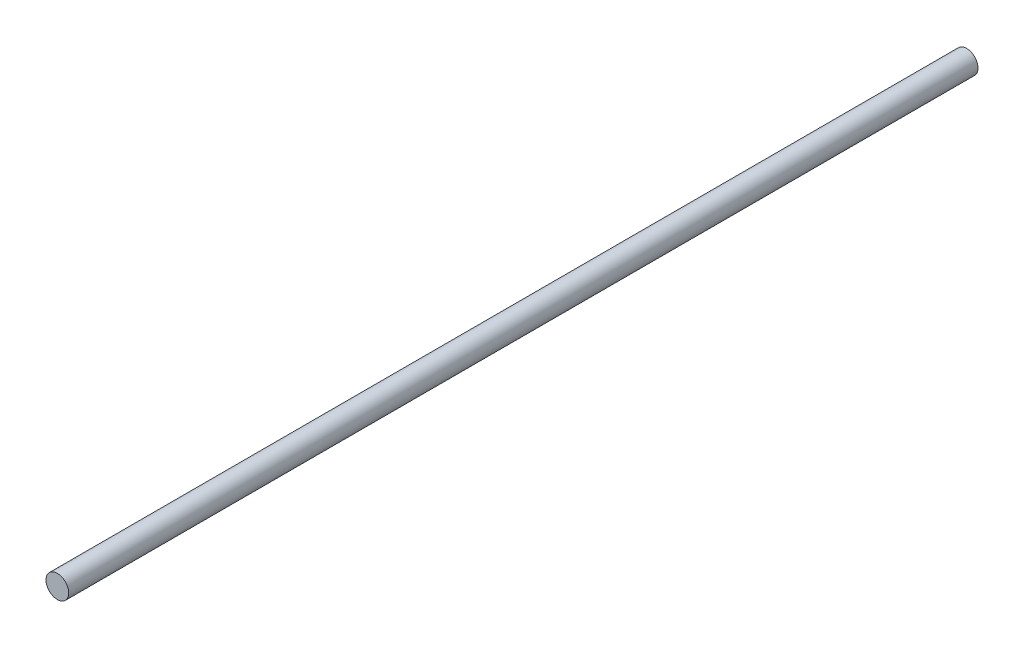
ISO-10303-21;
HEADER;
FILE_DESCRIPTION(('STEP AP214'),'2;1');
FILE_NAME('part.step','',(''),(''),'','','');
FILE_SCHEMA(('AUTOMOTIVE_DESIGN { 1 0 10303 214 1 1 1 1 }'));
ENDSEC;
DATA;
#1=APPLICATION_CONTEXT('core data for automotive mechanical design processes');
#2=APPLICATION_PROTOCOL_DEFINITION('international standard','automotive_design',2000,#1);
#3=PRODUCT_CONTEXT('',#1,'mechanical');
#4=PRODUCT('Part','Part','',(#3));
#5=PRODUCT_RELATED_PRODUCT_CATEGORY('part','',(#4));
#6=PRODUCT_DEFINITION_FORMATION('','',#4);
#7=PRODUCT_DEFINITION_CONTEXT('part definition',#1,'design');
#8=PRODUCT_DEFINITION('design','',#6,#7);
#9=PRODUCT_DEFINITION_SHAPE('','',#8);
#10=(LENGTH_UNIT() NAMED_UNIT(*) SI_UNIT(.MILLI.,.METRE.));
#11=(NAMED_UNIT(*) PLANE_ANGLE_UNIT() SI_UNIT($,.RADIAN.));
#12=(NAMED_UNIT(*) SI_UNIT($,.STERADIAN.) SOLID_ANGLE_UNIT());
#13=UNCERTAINTY_MEASURE_WITH_UNIT(LENGTH_MEASURE(1.E-05),#10,'distance_accuracy_value','');
#14=(GEOMETRIC_REPRESENTATION_CONTEXT(3) GLOBAL_UNCERTAINTY_ASSIGNED_CONTEXT((#13)) GLOBAL_UNIT_ASSIGNED_CONTEXT((#10,
#11,#12)) REPRESENTATION_CONTEXT('',''));
#15=CARTESIAN_POINT('',(0.,0.,0.));
#16=DIRECTION('',(0.,0.,1.));
#17=DIRECTION('',(1.,0.,0.));
#18=AXIS2_PLACEMENT_3D('',#15,#16,#17);
#19=CARTESIAN_POINT('',(0.,0.,600.));
#20=DIRECTION('',(0.,0.,-1.));
#21=DIRECTION('',(-1.,0.,0.));
#22=AXIS2_PLACEMENT_3D('',#19,#20,#21);
#23=CYLINDRICAL_SURFACE('',#22,7.5);
#24=CARTESIAN_POINT('',(0.,0.,600.));
#25=DIRECTION('',(0.,0.,1.));
#26=DIRECTION('',(1.,0.,0.));
#27=AXIS2_PLACEMENT_3D('',#24,#25,#26);
#28=CIRCLE('',#27,7.5);
#29=CARTESIAN_POINT('',(7.5,0.,600.));
#30=VERTEX_POINT('',#29);
#31=EDGE_CURVE('E10',#30,#30,#28,.T.);
#32=ORIENTED_EDGE('',*,*,#31,.F.);
#33=EDGE_LOOP('',(#32));
#34=FACE_BOUND('',#33,.T.);
#35=CARTESIAN_POINT('',(0.,0.,0.));
#36=DIRECTION('',(0.,0.,1.));
#37=DIRECTION('',(1.,0.,0.));
#38=AXIS2_PLACEMENT_3D('',#35,#36,#37);
#39=CIRCLE('',#38,7.5);
#40=CARTESIAN_POINT('',(7.5,0.,0.));
#41=VERTEX_POINT('',#40);
#42=EDGE_CURVE('E46',#41,#41,#39,.T.);
#43=ORIENTED_EDGE('',*,*,#42,.T.);
#44=EDGE_LOOP('',(#43));
#45=FACE_BOUND('',#44,.T.);
#46=ADVANCED_FACE('F43',(#34,#45),#23,.T.);
#47=CARTESIAN_POINT('',(0.,0.,600.));
#48=DIRECTION('',(0.,0.,1.));
#49=DIRECTION('',(1.,0.,0.));
#50=AXIS2_PLACEMENT_3D('',#47,#48,#49);
#51=PLANE('',#50);
#52=ORIENTED_EDGE('',*,*,#31,.T.);
#53=EDGE_LOOP('',(#52));
#54=FACE_BOUND('',#53,.T.);
#55=ADVANCED_FACE('F60',(#54),#51,.T.);
#56=CARTESIAN_POINT('',(0.,0.,0.));
#57=DIRECTION('',(0.,0.,1.));
#58=DIRECTION('',(1.,0.,0.));
#59=AXIS2_PLACEMENT_3D('',#56,#57,#58);
#60=PLANE('',#59);
#61=ORIENTED_EDGE('',*,*,#42,.F.);
#62=EDGE_LOOP('',(#61));
#63=FACE_BOUND('',#62,.T.);
#64=ADVANCED_FACE('F58',(#63),#60,.F.);
#65=CLOSED_SHELL('',(#46,#55,#64));
#66=MANIFOLD_SOLID_BREP('B2',#65);
#67=ADVANCED_BREP_SHAPE_REPRESENTATION('',(#18,#66),#14);
#68=SHAPE_DEFINITION_REPRESENTATION(#9,#67);
ENDSEC;
END-ISO-10303-21;
